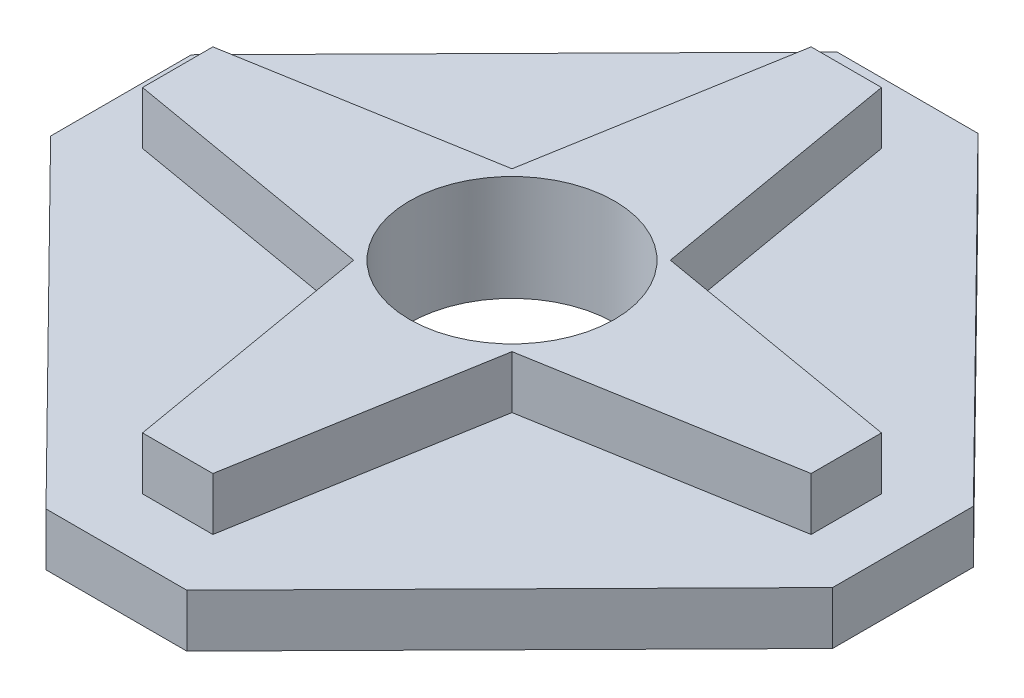
ISO-10303-21;
HEADER;
FILE_DESCRIPTION(('STEP AP214'),'2;1');
FILE_NAME('part.step','',(''),(''),'','','');
FILE_SCHEMA(('AUTOMOTIVE_DESIGN { 1 0 10303 214 1 1 1 1 }'));
ENDSEC;
DATA;
#1=APPLICATION_CONTEXT('core data for automotive mechanical design processes');
#2=APPLICATION_PROTOCOL_DEFINITION('international standard','automotive_design',2000,#1);
#3=PRODUCT_CONTEXT('',#1,'mechanical');
#4=PRODUCT('Part','Part','',(#3));
#5=PRODUCT_RELATED_PRODUCT_CATEGORY('part','',(#4));
#6=PRODUCT_DEFINITION_FORMATION('','',#4);
#7=PRODUCT_DEFINITION_CONTEXT('part definition',#1,'design');
#8=PRODUCT_DEFINITION('design','',#6,#7);
#9=PRODUCT_DEFINITION_SHAPE('','',#8);
#10=(LENGTH_UNIT() NAMED_UNIT(*) SI_UNIT(.MILLI.,.METRE.));
#11=(NAMED_UNIT(*) PLANE_ANGLE_UNIT() SI_UNIT($,.RADIAN.));
#12=(NAMED_UNIT(*) SI_UNIT($,.STERADIAN.) SOLID_ANGLE_UNIT());
#13=UNCERTAINTY_MEASURE_WITH_UNIT(LENGTH_MEASURE(1.E-05),#10,'distance_accuracy_value','');
#14=(GEOMETRIC_REPRESENTATION_CONTEXT(3) GLOBAL_UNCERTAINTY_ASSIGNED_CONTEXT((#13)) GLOBAL_UNIT_ASSIGNED_CONTEXT((#10,
#11,#12)) REPRESENTATION_CONTEXT('',''));
#15=CARTESIAN_POINT('',(0.,0.,0.));
#16=DIRECTION('',(0.,0.,1.));
#17=DIRECTION('',(1.,0.,0.));
#18=AXIS2_PLACEMENT_3D('',#15,#16,#17);
#19=CARTESIAN_POINT('',(2.,3.,-19.));
#20=DIRECTION('',(-0.985460115744348,0.,0.169906916507646));
#21=DIRECTION('',(0.169906916507646,0.,0.985460115744348));
#22=AXIS2_PLACEMENT_3D('',#19,#20,#21);
#23=PLANE('',#22);
#24=DIRECTION('',(-0.169906916507646,0.,-0.985460115744348));
#25=VECTOR('',#24,1.);
#26=CARTESIAN_POINT('',(2.,0.,-19.));
#27=LINE('',#26,#25);
#28=CARTESIAN_POINT('',(4.5,0.,-4.5));
#29=VERTEX_POINT('',#28);
#30=CARTESIAN_POINT('',(2.,0.,-19.));
#31=VERTEX_POINT('',#30);
#32=EDGE_CURVE('E257',#29,#31,#27,.T.);
#33=ORIENTED_EDGE('',*,*,#32,.T.);
#34=DIRECTION('',(0.,-1.,0.));
#35=VECTOR('',#34,1.);
#36=CARTESIAN_POINT('',(2.,3.,-19.));
#37=LINE('',#36,#35);
#38=CARTESIAN_POINT('',(2.,3.,-19.));
#39=VERTEX_POINT('',#38);
#40=EDGE_CURVE('E11',#39,#31,#37,.T.);
#41=ORIENTED_EDGE('',*,*,#40,.F.);
#42=DIRECTION('',(-0.169906916507646,0.,-0.985460115744348));
#43=VECTOR('',#42,1.);
#44=CARTESIAN_POINT('',(2.,3.,-19.));
#45=LINE('',#44,#43);
#46=CARTESIAN_POINT('',(4.5,3.,-4.5));
#47=VERTEX_POINT('',#46);
#48=EDGE_CURVE('E275',#47,#39,#45,.T.);
#49=ORIENTED_EDGE('',*,*,#48,.F.);
#50=DIRECTION('',(0.,-1.,0.));
#51=VECTOR('',#50,1.);
#52=CARTESIAN_POINT('',(4.5,3.,-4.5));
#53=LINE('',#52,#51);
#54=EDGE_CURVE('E311',#47,#29,#53,.T.);
#55=ORIENTED_EDGE('',*,*,#54,.T.);
#56=EDGE_LOOP('',(#33,#41,#49,#55));
#57=FACE_BOUND('',#56,.T.);
#58=ADVANCED_FACE('F39',(#57),#23,.F.);
#59=CARTESIAN_POINT('',(-2.,3.,-19.));
#60=DIRECTION('',(0.,0.,1.));
#61=DIRECTION('',(1.,0.,0.));
#62=AXIS2_PLACEMENT_3D('',#59,#60,#61);
#63=PLANE('',#62);
#64=DIRECTION('',(-1.,0.,0.));
#65=VECTOR('',#64,1.);
#66=CARTESIAN_POINT('',(-2.,0.,-19.));
#67=LINE('',#66,#65);
#68=CARTESIAN_POINT('',(-2.,0.,-19.));
#69=VERTEX_POINT('',#68);
#70=EDGE_CURVE('E315',#31,#69,#67,.T.);
#71=ORIENTED_EDGE('',*,*,#70,.T.);
#72=DIRECTION('',(0.,-1.,0.));
#73=VECTOR('',#72,1.);
#74=CARTESIAN_POINT('',(-2.,3.,-19.));
#75=LINE('',#74,#73);
#76=CARTESIAN_POINT('',(-2.,3.,-19.));
#77=VERTEX_POINT('',#76);
#78=EDGE_CURVE('E49',#77,#69,#75,.T.);
#79=ORIENTED_EDGE('',*,*,#78,.F.);
#80=DIRECTION('',(-1.,0.,0.));
#81=VECTOR('',#80,1.);
#82=CARTESIAN_POINT('',(-2.,3.,-19.));
#83=LINE('',#82,#81);
#84=EDGE_CURVE('E278',#39,#77,#83,.T.);
#85=ORIENTED_EDGE('',*,*,#84,.F.);
#86=ORIENTED_EDGE('',*,*,#40,.T.);
#87=EDGE_LOOP('',(#71,#79,#85,#86));
#88=FACE_BOUND('',#87,.T.);
#89=ADVANCED_FACE('F406',(#88),#63,.F.);
#90=CARTESIAN_POINT('',(-2.,3.,-19.));
#91=DIRECTION('',(0.985460115744348,0.,0.169906916507646));
#92=DIRECTION('',(0.169906916507646,0.,-0.985460115744348));
#93=AXIS2_PLACEMENT_3D('',#90,#91,#92);
#94=PLANE('',#93);
#95=DIRECTION('',(-0.169906916507646,0.,0.985460115744348));
#96=VECTOR('',#95,1.);
#97=CARTESIAN_POINT('',(-2.,0.,-19.));
#98=LINE('',#97,#96);
#99=CARTESIAN_POINT('',(-4.5,0.,-4.5));
#100=VERTEX_POINT('',#99);
#101=EDGE_CURVE('E319',#69,#100,#98,.T.);
#102=ORIENTED_EDGE('',*,*,#101,.T.);
#103=DIRECTION('',(0.,-1.,0.));
#104=VECTOR('',#103,1.);
#105=CARTESIAN_POINT('',(-4.5,3.,-4.5));
#106=LINE('',#105,#104);
#107=CARTESIAN_POINT('',(-4.5,3.,-4.5));
#108=VERTEX_POINT('',#107);
#109=EDGE_CURVE('E393',#108,#100,#106,.T.);
#110=ORIENTED_EDGE('',*,*,#109,.F.);
#111=DIRECTION('',(-0.169906916507646,0.,0.985460115744348));
#112=VECTOR('',#111,1.);
#113=CARTESIAN_POINT('',(-2.,3.,-19.));
#114=LINE('',#113,#112);
#115=EDGE_CURVE('E282',#77,#108,#114,.T.);
#116=ORIENTED_EDGE('',*,*,#115,.F.);
#117=ORIENTED_EDGE('',*,*,#78,.T.);
#118=EDGE_LOOP('',(#102,#110,#116,#117));
#119=FACE_BOUND('',#118,.T.);
#120=ADVANCED_FACE('F402',(#119),#94,.F.);
#121=CARTESIAN_POINT('',(-4.5,3.,-4.5));
#122=DIRECTION('',(0.169906916507646,0.,0.985460115744348));
#123=DIRECTION('',(0.985460115744348,0.,-0.169906916507646));
#124=AXIS2_PLACEMENT_3D('',#121,#122,#123);
#125=PLANE('',#124);
#126=DIRECTION('',(-0.985460115744348,0.,0.169906916507646));
#127=VECTOR('',#126,1.);
#128=CARTESIAN_POINT('',(-4.5,0.,-4.5));
#129=LINE('',#128,#127);
#130=CARTESIAN_POINT('',(-19.,0.,-2.));
#131=VERTEX_POINT('',#130);
#132=EDGE_CURVE('E323',#100,#131,#129,.T.);
#133=ORIENTED_EDGE('',*,*,#132,.T.);
#134=DIRECTION('',(0.,-1.,0.));
#135=VECTOR('',#134,1.);
#136=CARTESIAN_POINT('',(-19.,3.,-2.));
#137=LINE('',#136,#135);
#138=CARTESIAN_POINT('',(-19.,3.,-2.));
#139=VERTEX_POINT('',#138);
#140=EDGE_CURVE('E389',#139,#131,#137,.T.);
#141=ORIENTED_EDGE('',*,*,#140,.F.);
#142=DIRECTION('',(-0.985460115744348,0.,0.169906916507646));
#143=VECTOR('',#142,1.);
#144=CARTESIAN_POINT('',(-4.5,3.,-4.5));
#145=LINE('',#144,#143);
#146=EDGE_CURVE('E285',#108,#139,#145,.T.);
#147=ORIENTED_EDGE('',*,*,#146,.F.);
#148=ORIENTED_EDGE('',*,*,#109,.T.);
#149=EDGE_LOOP('',(#133,#141,#147,#148));
#150=FACE_BOUND('',#149,.T.);
#151=ADVANCED_FACE('F413',(#150),#125,.F.);
#152=CARTESIAN_POINT('',(-19.,3.,-2.));
#153=DIRECTION('',(1.,0.,0.));
#154=DIRECTION('',(0.,0.,-1.));
#155=AXIS2_PLACEMENT_3D('',#152,#153,#154);
#156=PLANE('',#155);
#157=DIRECTION('',(0.,0.,1.));
#158=VECTOR('',#157,1.);
#159=CARTESIAN_POINT('',(-19.,0.,-2.));
#160=LINE('',#159,#158);
#161=CARTESIAN_POINT('',(-19.,0.,2.));
#162=VERTEX_POINT('',#161);
#163=EDGE_CURVE('E327',#131,#162,#160,.T.);
#164=ORIENTED_EDGE('',*,*,#163,.T.);
#165=DIRECTION('',(0.,-1.,0.));
#166=VECTOR('',#165,1.);
#167=CARTESIAN_POINT('',(-19.,3.,2.));
#168=LINE('',#167,#166);
#169=CARTESIAN_POINT('',(-19.,3.,2.));
#170=VERTEX_POINT('',#169);
#171=EDGE_CURVE('E385',#170,#162,#168,.T.);
#172=ORIENTED_EDGE('',*,*,#171,.F.);
#173=DIRECTION('',(0.,0.,1.));
#174=VECTOR('',#173,1.);
#175=CARTESIAN_POINT('',(-19.,3.,-2.));
#176=LINE('',#175,#174);
#177=EDGE_CURVE('E288',#139,#170,#176,.T.);
#178=ORIENTED_EDGE('',*,*,#177,.F.);
#179=ORIENTED_EDGE('',*,*,#140,.T.);
#180=EDGE_LOOP('',(#164,#172,#178,#179));
#181=FACE_BOUND('',#180,.T.);
#182=ADVANCED_FACE('F417',(#181),#156,.F.);
#183=CARTESIAN_POINT('',(-4.5,3.,4.5));
#184=DIRECTION('',(0.169906916507646,0.,-0.985460115744348));
#185=DIRECTION('',(-0.985460115744348,0.,-0.169906916507646));
#186=AXIS2_PLACEMENT_3D('',#183,#184,#185);
#187=PLANE('',#186);
#188=DIRECTION('',(0.985460115744348,0.,0.169906916507646));
#189=VECTOR('',#188,1.);
#190=CARTESIAN_POINT('',(-4.5,0.,4.5));
#191=LINE('',#190,#189);
#192=CARTESIAN_POINT('',(-4.5,0.,4.5));
#193=VERTEX_POINT('',#192);
#194=EDGE_CURVE('E331',#162,#193,#191,.T.);
#195=ORIENTED_EDGE('',*,*,#194,.T.);
#196=DIRECTION('',(0.,-1.,0.));
#197=VECTOR('',#196,1.);
#198=CARTESIAN_POINT('',(-4.5,3.,4.5));
#199=LINE('',#198,#197);
#200=CARTESIAN_POINT('',(-4.5,3.,4.5));
#201=VERTEX_POINT('',#200);
#202=EDGE_CURVE('E381',#201,#193,#199,.T.);
#203=ORIENTED_EDGE('',*,*,#202,.F.);
#204=DIRECTION('',(0.985460115744348,0.,0.169906916507646));
#205=VECTOR('',#204,1.);
#206=CARTESIAN_POINT('',(-4.5,3.,4.5));
#207=LINE('',#206,#205);
#208=EDGE_CURVE('E291',#170,#201,#207,.T.);
#209=ORIENTED_EDGE('',*,*,#208,.F.);
#210=ORIENTED_EDGE('',*,*,#171,.T.);
#211=EDGE_LOOP('',(#195,#203,#209,#210));
#212=FACE_BOUND('',#211,.T.);
#213=ADVANCED_FACE('F447',(#212),#187,.F.);
#214=CARTESIAN_POINT('',(-1.99999999999999,3.,19.));
#215=DIRECTION('',(0.985460115744348,0.,-0.169906916507647));
#216=DIRECTION('',(-0.169906916507647,0.,-0.985460115744348));
#217=AXIS2_PLACEMENT_3D('',#214,#215,#216);
#218=PLANE('',#217);
#219=DIRECTION('',(0.169906916507647,0.,0.985460115744348));
#220=VECTOR('',#219,1.);
#221=CARTESIAN_POINT('',(-1.99999999999999,0.,19.));
#222=LINE('',#221,#220);
#223=CARTESIAN_POINT('',(-1.99999999999999,0.,19.));
#224=VERTEX_POINT('',#223);
#225=EDGE_CURVE('E335',#193,#224,#222,.T.);
#226=ORIENTED_EDGE('',*,*,#225,.T.);
#227=DIRECTION('',(0.,-1.,0.));
#228=VECTOR('',#227,1.);
#229=CARTESIAN_POINT('',(-1.99999999999999,3.,19.));
#230=LINE('',#229,#228);
#231=CARTESIAN_POINT('',(-1.99999999999999,3.,19.));
#232=VERTEX_POINT('',#231);
#233=EDGE_CURVE('E377',#232,#224,#230,.T.);
#234=ORIENTED_EDGE('',*,*,#233,.F.);
#235=DIRECTION('',(0.169906916507647,0.,0.985460115744348));
#236=VECTOR('',#235,1.);
#237=CARTESIAN_POINT('',(-1.99999999999999,3.,19.));
#238=LINE('',#237,#236);
#239=EDGE_CURVE('E294',#201,#232,#238,.T.);
#240=ORIENTED_EDGE('',*,*,#239,.F.);
#241=ORIENTED_EDGE('',*,*,#202,.T.);
#242=EDGE_LOOP('',(#226,#234,#240,#241));
#243=FACE_BOUND('',#242,.T.);
#244=ADVANCED_FACE('F444',(#243),#218,.F.);
#245=CARTESIAN_POINT('',(-1.99999999999999,3.,19.));
#246=DIRECTION('',(0.,0.,-1.));
#247=DIRECTION('',(-1.,0.,0.));
#248=AXIS2_PLACEMENT_3D('',#245,#246,#247);
#249=PLANE('',#248);
#250=DIRECTION('',(1.,0.,0.));
#251=VECTOR('',#250,1.);
#252=CARTESIAN_POINT('',(-1.99999999999999,0.,19.));
#253=LINE('',#252,#251);
#254=CARTESIAN_POINT('',(2.,0.,19.));
#255=VERTEX_POINT('',#254);
#256=EDGE_CURVE('E339',#224,#255,#253,.T.);
#257=ORIENTED_EDGE('',*,*,#256,.T.);
#258=DIRECTION('',(0.,-1.,0.));
#259=VECTOR('',#258,1.);
#260=CARTESIAN_POINT('',(2.,3.,19.));
#261=LINE('',#260,#259);
#262=CARTESIAN_POINT('',(2.,3.,19.));
#263=VERTEX_POINT('',#262);
#264=EDGE_CURVE('E373',#263,#255,#261,.T.);
#265=ORIENTED_EDGE('',*,*,#264,.F.);
#266=DIRECTION('',(1.,0.,0.));
#267=VECTOR('',#266,1.);
#268=CARTESIAN_POINT('',(-1.99999999999999,3.,19.));
#269=LINE('',#268,#267);
#270=EDGE_CURVE('E297',#232,#263,#269,.T.);
#271=ORIENTED_EDGE('',*,*,#270,.F.);
#272=ORIENTED_EDGE('',*,*,#233,.T.);
#273=EDGE_LOOP('',(#257,#265,#271,#272));
#274=FACE_BOUND('',#273,.T.);
#275=ADVANCED_FACE('F441',(#274),#249,.F.);
#276=CARTESIAN_POINT('',(2.,3.,19.));
#277=DIRECTION('',(-0.985460115744348,0.,-0.169906916507646));
#278=DIRECTION('',(-0.169906916507646,0.,0.985460115744348));
#279=AXIS2_PLACEMENT_3D('',#276,#277,#278);
#280=PLANE('',#279);
#281=DIRECTION('',(0.169906916507646,0.,-0.985460115744348));
#282=VECTOR('',#281,1.);
#283=CARTESIAN_POINT('',(2.,0.,19.));
#284=LINE('',#283,#282);
#285=CARTESIAN_POINT('',(4.5,0.,4.5));
#286=VERTEX_POINT('',#285);
#287=EDGE_CURVE('E343',#255,#286,#284,.T.);
#288=ORIENTED_EDGE('',*,*,#287,.T.);
#289=DIRECTION('',(0.,-1.,0.));
#290=VECTOR('',#289,1.);
#291=CARTESIAN_POINT('',(4.5,3.,4.5));
#292=LINE('',#291,#290);
#293=CARTESIAN_POINT('',(4.5,3.,4.5));
#294=VERTEX_POINT('',#293);
#295=EDGE_CURVE('E369',#294,#286,#292,.T.);
#296=ORIENTED_EDGE('',*,*,#295,.F.);
#297=DIRECTION('',(0.169906916507646,0.,-0.985460115744348));
#298=VECTOR('',#297,1.);
#299=CARTESIAN_POINT('',(2.,3.,19.));
#300=LINE('',#299,#298);
#301=EDGE_CURVE('E300',#263,#294,#300,.T.);
#302=ORIENTED_EDGE('',*,*,#301,.F.);
#303=ORIENTED_EDGE('',*,*,#264,.T.);
#304=EDGE_LOOP('',(#288,#296,#302,#303));
#305=FACE_BOUND('',#304,.T.);
#306=ADVANCED_FACE('F436',(#305),#280,.F.);
#307=CARTESIAN_POINT('',(4.5,3.,4.5));
#308=DIRECTION('',(-0.169906916507646,0.,-0.985460115744348));
#309=DIRECTION('',(-0.985460115744348,0.,0.169906916507646));
#310=AXIS2_PLACEMENT_3D('',#307,#308,#309);
#311=PLANE('',#310);
#312=DIRECTION('',(0.985460115744348,0.,-0.169906916507646));
#313=VECTOR('',#312,1.);
#314=CARTESIAN_POINT('',(4.5,0.,4.5));
#315=LINE('',#314,#313);
#316=CARTESIAN_POINT('',(19.,0.,2.));
#317=VERTEX_POINT('',#316);
#318=EDGE_CURVE('E347',#286,#317,#315,.T.);
#319=ORIENTED_EDGE('',*,*,#318,.T.);
#320=DIRECTION('',(0.,-1.,0.));
#321=VECTOR('',#320,1.);
#322=CARTESIAN_POINT('',(19.,3.,2.));
#323=LINE('',#322,#321);
#324=CARTESIAN_POINT('',(19.,3.,2.));
#325=VERTEX_POINT('',#324);
#326=EDGE_CURVE('E365',#325,#317,#323,.T.);
#327=ORIENTED_EDGE('',*,*,#326,.F.);
#328=DIRECTION('',(0.985460115744348,0.,-0.169906916507646));
#329=VECTOR('',#328,1.);
#330=CARTESIAN_POINT('',(4.5,3.,4.5));
#331=LINE('',#330,#329);
#332=EDGE_CURVE('E303',#294,#325,#331,.T.);
#333=ORIENTED_EDGE('',*,*,#332,.F.);
#334=ORIENTED_EDGE('',*,*,#295,.T.);
#335=EDGE_LOOP('',(#319,#327,#333,#334));
#336=FACE_BOUND('',#335,.T.);
#337=ADVANCED_FACE('F433',(#336),#311,.F.);
#338=CARTESIAN_POINT('',(19.,3.,-2.));
#339=DIRECTION('',(-1.,0.,0.));
#340=DIRECTION('',(0.,0.,1.));
#341=AXIS2_PLACEMENT_3D('',#338,#339,#340);
#342=PLANE('',#341);
#343=DIRECTION('',(0.,0.,-1.));
#344=VECTOR('',#343,1.);
#345=CARTESIAN_POINT('',(19.,0.,-2.));
#346=LINE('',#345,#344);
#347=CARTESIAN_POINT('',(19.,0.,-2.));
#348=VERTEX_POINT('',#347);
#349=EDGE_CURVE('E351',#317,#348,#346,.T.);
#350=ORIENTED_EDGE('',*,*,#349,.T.);
#351=DIRECTION('',(0.,-1.,0.));
#352=VECTOR('',#351,1.);
#353=CARTESIAN_POINT('',(19.,3.,-2.));
#354=LINE('',#353,#352);
#355=CARTESIAN_POINT('',(19.,3.,-2.));
#356=VERTEX_POINT('',#355);
#357=EDGE_CURVE('E361',#356,#348,#354,.T.);
#358=ORIENTED_EDGE('',*,*,#357,.F.);
#359=DIRECTION('',(0.,0.,-1.));
#360=VECTOR('',#359,1.);
#361=CARTESIAN_POINT('',(19.,3.,-2.));
#362=LINE('',#361,#360);
#363=EDGE_CURVE('E306',#325,#356,#362,.T.);
#364=ORIENTED_EDGE('',*,*,#363,.F.);
#365=ORIENTED_EDGE('',*,*,#326,.T.);
#366=EDGE_LOOP('',(#350,#358,#364,#365));
#367=FACE_BOUND('',#366,.T.);
#368=ADVANCED_FACE('F428',(#367),#342,.F.);
#369=CARTESIAN_POINT('',(4.5,3.,-4.5));
#370=DIRECTION('',(-0.169906916507646,0.,0.985460115744348));
#371=DIRECTION('',(0.985460115744348,0.,0.169906916507646));
#372=AXIS2_PLACEMENT_3D('',#369,#370,#371);
#373=PLANE('',#372);
#374=DIRECTION('',(-0.985460115744348,0.,-0.169906916507646));
#375=VECTOR('',#374,1.);
#376=CARTESIAN_POINT('',(4.5,0.,-4.5));
#377=LINE('',#376,#375);
#378=EDGE_CURVE('E279',#348,#29,#377,.T.);
#379=ORIENTED_EDGE('',*,*,#378,.T.);
#380=ORIENTED_EDGE('',*,*,#54,.F.);
#381=DIRECTION('',(-0.985460115744348,0.,-0.169906916507646));
#382=VECTOR('',#381,1.);
#383=CARTESIAN_POINT('',(4.5,3.,-4.5));
#384=LINE('',#383,#382);
#385=EDGE_CURVE('E56',#356,#47,#384,.T.);
#386=ORIENTED_EDGE('',*,*,#385,.F.);
#387=ORIENTED_EDGE('',*,*,#357,.T.);
#388=EDGE_LOOP('',(#379,#380,#386,#387));
#389=FACE_BOUND('',#388,.T.);
#390=ADVANCED_FACE('F425',(#389),#373,.F.);
#391=CARTESIAN_POINT('',(0.,3.,0.));
#392=DIRECTION('',(0.,1.,0.));
#393=DIRECTION('',(0.,0.,1.));
#394=AXIS2_PLACEMENT_3D('',#391,#392,#393);
#395=PLANE('',#394);
#396=CARTESIAN_POINT('',(0.,3.,0.));
#397=DIRECTION('',(0.,1.,0.));
#398=DIRECTION('',(0.,0.,1.));
#399=AXIS2_PLACEMENT_3D('',#396,#397,#398);
#400=CIRCLE('',#399,5.8291544910548);
#401=CARTESIAN_POINT('',(0.,3.,5.8291544910548));
#402=VERTEX_POINT('',#401);
#403=EDGE_CURVE('E209',#402,#402,#400,.F.);
#404=ORIENTED_EDGE('',*,*,#403,.T.);
#405=EDGE_LOOP('',(#404));
#406=FACE_BOUND('',#405,.T.);
#407=ORIENTED_EDGE('',*,*,#48,.T.);
#408=ORIENTED_EDGE('',*,*,#84,.T.);
#409=ORIENTED_EDGE('',*,*,#115,.T.);
#410=ORIENTED_EDGE('',*,*,#146,.T.);
#411=ORIENTED_EDGE('',*,*,#177,.T.);
#412=ORIENTED_EDGE('',*,*,#208,.T.);
#413=ORIENTED_EDGE('',*,*,#239,.T.);
#414=ORIENTED_EDGE('',*,*,#270,.T.);
#415=ORIENTED_EDGE('',*,*,#301,.T.);
#416=ORIENTED_EDGE('',*,*,#332,.T.);
#417=ORIENTED_EDGE('',*,*,#363,.T.);
#418=ORIENTED_EDGE('',*,*,#385,.T.);
#419=EDGE_LOOP('',(#407,#408,#409,#410,#411,#412,#413,#414,#415,#416,#417,#418));
#420=FACE_BOUND('',#419,.T.);
#421=ADVANCED_FACE('F420',(#406,#420),#395,.T.);
#422=CARTESIAN_POINT('',(-4.,-3.,-22.4839374692319));
#423=DIRECTION('',(-0.712134524828602,0.,-0.702043031834332));
#424=DIRECTION('',(-0.702043031834332,0.,0.712134524828602));
#425=AXIS2_PLACEMENT_3D('',#422,#423,#424);
#426=PLANE('',#425);
#427=DIRECTION('',(-0.702043031834332,0.,0.712134524828602));
#428=VECTOR('',#427,1.);
#429=CARTESIAN_POINT('',(-4.,0.,-22.4839374692319));
#430=LINE('',#429,#428);
#431=CARTESIAN_POINT('',(-4.,0.,-22.4839374692319));
#432=VERTEX_POINT('',#431);
#433=CARTESIAN_POINT('',(-22.2220058833111,0.,-4.));
#434=VERTEX_POINT('',#433);
#435=EDGE_CURVE('E231',#432,#434,#430,.T.);
#436=ORIENTED_EDGE('',*,*,#435,.F.);
#437=DIRECTION('',(0.,1.,0.));
#438=VECTOR('',#437,1.);
#439=CARTESIAN_POINT('',(-4.,-3.,-22.4839374692319));
#440=LINE('',#439,#438);
#441=CARTESIAN_POINT('',(-4.,-3.,-22.4839374692319));
#442=VERTEX_POINT('',#441);
#443=EDGE_CURVE('E200',#442,#432,#440,.T.);
#444=ORIENTED_EDGE('',*,*,#443,.F.);
#445=DIRECTION('',(-0.702043031834332,0.,0.712134524828602));
#446=VECTOR('',#445,1.);
#447=CARTESIAN_POINT('',(-4.,-3.,-22.4839374692319));
#448=LINE('',#447,#446);
#449=CARTESIAN_POINT('',(-22.2220058833111,-3.,-4.));
#450=VERTEX_POINT('',#449);
#451=EDGE_CURVE('E192',#442,#450,#448,.T.);
#452=ORIENTED_EDGE('',*,*,#451,.T.);
#453=DIRECTION('',(0.,1.,0.));
#454=VECTOR('',#453,1.);
#455=CARTESIAN_POINT('',(-22.2220058833111,-3.,-4.));
#456=LINE('',#455,#454);
#457=EDGE_CURVE('E173',#450,#434,#456,.T.);
#458=ORIENTED_EDGE('',*,*,#457,.T.);
#459=EDGE_LOOP('',(#436,#444,#452,#458));
#460=FACE_BOUND('',#459,.T.);
#461=ADVANCED_FACE('F199',(#460),#426,.T.);
#462=CARTESIAN_POINT('',(4.,-3.,-22.4839374692319));
#463=DIRECTION('',(0.,0.,-1.));
#464=DIRECTION('',(-1.,0.,0.));
#465=AXIS2_PLACEMENT_3D('',#462,#463,#464);
#466=PLANE('',#465);
#467=DIRECTION('',(-1.,0.,0.));
#468=VECTOR('',#467,1.);
#469=CARTESIAN_POINT('',(4.,0.,-22.4839374692319));
#470=LINE('',#469,#468);
#471=CARTESIAN_POINT('',(4.,0.,-22.4839374692319));
#472=VERTEX_POINT('',#471);
#473=EDGE_CURVE('E202',#472,#432,#470,.T.);
#474=ORIENTED_EDGE('',*,*,#473,.F.);
#475=DIRECTION('',(0.,1.,0.));
#476=VECTOR('',#475,1.);
#477=CARTESIAN_POINT('',(4.,-3.,-22.4839374692319));
#478=LINE('',#477,#476);
#479=CARTESIAN_POINT('',(4.,-3.,-22.4839374692319));
#480=VERTEX_POINT('',#479);
#481=EDGE_CURVE('E258',#480,#472,#478,.T.);
#482=ORIENTED_EDGE('',*,*,#481,.F.);
#483=DIRECTION('',(-1.,0.,0.));
#484=VECTOR('',#483,1.);
#485=CARTESIAN_POINT('',(4.,-3.,-22.4839374692319));
#486=LINE('',#485,#484);
#487=EDGE_CURVE('E185',#480,#442,#486,.T.);
#488=ORIENTED_EDGE('',*,*,#487,.T.);
#489=ORIENTED_EDGE('',*,*,#443,.T.);
#490=EDGE_LOOP('',(#474,#482,#488,#489));
#491=FACE_BOUND('',#490,.T.);
#492=ADVANCED_FACE('F535',(#491),#466,.T.);
#493=CARTESIAN_POINT('',(4.,-3.,-22.4839374692319));
#494=DIRECTION('',(0.712134524828602,0.,-0.702043031834332));
#495=DIRECTION('',(-0.702043031834332,0.,-0.712134524828602));
#496=AXIS2_PLACEMENT_3D('',#493,#494,#495);
#497=PLANE('',#496);
#498=DIRECTION('',(-0.702043031834332,0.,-0.712134524828602));
#499=VECTOR('',#498,1.);
#500=CARTESIAN_POINT('',(4.,0.,-22.4839374692319));
#501=LINE('',#500,#499);
#502=CARTESIAN_POINT('',(22.2220058833111,0.,-4.00000000000001));
#503=VERTEX_POINT('',#502);
#504=EDGE_CURVE('E206',#503,#472,#501,.T.);
#505=ORIENTED_EDGE('',*,*,#504,.F.);
#506=DIRECTION('',(0.,1.,0.));
#507=VECTOR('',#506,1.);
#508=CARTESIAN_POINT('',(22.2220058833111,-3.,-4.00000000000001));
#509=LINE('',#508,#507);
#510=CARTESIAN_POINT('',(22.2220058833111,-3.,-4.00000000000001));
#511=VERTEX_POINT('',#510);
#512=EDGE_CURVE('E261',#511,#503,#509,.T.);
#513=ORIENTED_EDGE('',*,*,#512,.F.);
#514=DIRECTION('',(-0.702043031834332,0.,-0.712134524828602));
#515=VECTOR('',#514,1.);
#516=CARTESIAN_POINT('',(4.,-3.,-22.4839374692319));
#517=LINE('',#516,#515);
#518=EDGE_CURVE('E225',#511,#480,#517,.T.);
#519=ORIENTED_EDGE('',*,*,#518,.T.);
#520=ORIENTED_EDGE('',*,*,#481,.T.);
#521=EDGE_LOOP('',(#505,#513,#519,#520));
#522=FACE_BOUND('',#521,.T.);
#523=ADVANCED_FACE('F544',(#522),#497,.T.);
#524=CARTESIAN_POINT('',(22.2220058833111,-3.,-4.00000000000001));
#525=DIRECTION('',(1.,0.,0.));
#526=DIRECTION('',(0.,0.,-1.));
#527=AXIS2_PLACEMENT_3D('',#524,#525,#526);
#528=PLANE('',#527);
#529=DIRECTION('',(0.,0.,-1.));
#530=VECTOR('',#529,1.);
#531=CARTESIAN_POINT('',(22.2220058833111,0.,-4.00000000000001));
#532=LINE('',#531,#530);
#533=CARTESIAN_POINT('',(22.2220058833111,0.,4.00000000000001));
#534=VERTEX_POINT('',#533);
#535=EDGE_CURVE('E248',#534,#503,#532,.T.);
#536=ORIENTED_EDGE('',*,*,#535,.F.);
#537=DIRECTION('',(0.,1.,0.));
#538=VECTOR('',#537,1.);
#539=CARTESIAN_POINT('',(22.2220058833111,-3.,4.00000000000001));
#540=LINE('',#539,#538);
#541=CARTESIAN_POINT('',(22.2220058833111,-3.,4.00000000000001));
#542=VERTEX_POINT('',#541);
#543=EDGE_CURVE('E264',#542,#534,#540,.T.);
#544=ORIENTED_EDGE('',*,*,#543,.F.);
#545=DIRECTION('',(0.,0.,-1.));
#546=VECTOR('',#545,1.);
#547=CARTESIAN_POINT('',(22.2220058833111,-3.,-4.00000000000001));
#548=LINE('',#547,#546);
#549=EDGE_CURVE('E221',#542,#511,#548,.T.);
#550=ORIENTED_EDGE('',*,*,#549,.T.);
#551=ORIENTED_EDGE('',*,*,#512,.T.);
#552=EDGE_LOOP('',(#536,#544,#550,#551));
#553=FACE_BOUND('',#552,.T.);
#554=ADVANCED_FACE('F554',(#553),#528,.T.);
#555=CARTESIAN_POINT('',(4.,-3.,22.4839374692319));
#556=DIRECTION('',(0.712134524828602,0.,0.702043031834332));
#557=DIRECTION('',(0.702043031834332,0.,-0.712134524828602));
#558=AXIS2_PLACEMENT_3D('',#555,#556,#557);
#559=PLANE('',#558);
#560=DIRECTION('',(0.702043031834332,0.,-0.712134524828602));
#561=VECTOR('',#560,1.);
#562=CARTESIAN_POINT('',(4.,0.,22.4839374692319));
#563=LINE('',#562,#561);
#564=CARTESIAN_POINT('',(4.,0.,22.4839374692319));
#565=VERTEX_POINT('',#564);
#566=EDGE_CURVE('E244',#565,#534,#563,.T.);
#567=ORIENTED_EDGE('',*,*,#566,.F.);
#568=DIRECTION('',(0.,1.,0.));
#569=VECTOR('',#568,1.);
#570=CARTESIAN_POINT('',(4.,-3.,22.4839374692319));
#571=LINE('',#570,#569);
#572=CARTESIAN_POINT('',(4.,-3.,22.4839374692319));
#573=VERTEX_POINT('',#572);
#574=EDGE_CURVE('E267',#573,#565,#571,.T.);
#575=ORIENTED_EDGE('',*,*,#574,.F.);
#576=DIRECTION('',(0.702043031834332,0.,-0.712134524828602));
#577=VECTOR('',#576,1.);
#578=CARTESIAN_POINT('',(4.,-3.,22.4839374692319));
#579=LINE('',#578,#577);
#580=EDGE_CURVE('E217',#573,#542,#579,.T.);
#581=ORIENTED_EDGE('',*,*,#580,.T.);
#582=ORIENTED_EDGE('',*,*,#543,.T.);
#583=EDGE_LOOP('',(#567,#575,#581,#582));
#584=FACE_BOUND('',#583,.T.);
#585=ADVANCED_FACE('F564',(#584),#559,.T.);
#586=CARTESIAN_POINT('',(4.,-3.,22.4839374692319));
#587=DIRECTION('',(0.,0.,1.));
#588=DIRECTION('',(1.,0.,0.));
#589=AXIS2_PLACEMENT_3D('',#586,#587,#588);
#590=PLANE('',#589);
#591=DIRECTION('',(1.,0.,0.));
#592=VECTOR('',#591,1.);
#593=CARTESIAN_POINT('',(4.,0.,22.4839374692319));
#594=LINE('',#593,#592);
#595=CARTESIAN_POINT('',(-4.,0.,22.4839374692319));
#596=VERTEX_POINT('',#595);
#597=EDGE_CURVE('E240',#596,#565,#594,.T.);
#598=ORIENTED_EDGE('',*,*,#597,.F.);
#599=DIRECTION('',(0.,1.,0.));
#600=VECTOR('',#599,1.);
#601=CARTESIAN_POINT('',(-4.,-3.,22.4839374692319));
#602=LINE('',#601,#600);
#603=CARTESIAN_POINT('',(-4.,-3.,22.4839374692319));
#604=VERTEX_POINT('',#603);
#605=EDGE_CURVE('E270',#604,#596,#602,.T.);
#606=ORIENTED_EDGE('',*,*,#605,.F.);
#607=DIRECTION('',(1.,0.,0.));
#608=VECTOR('',#607,1.);
#609=CARTESIAN_POINT('',(4.,-3.,22.4839374692319));
#610=LINE('',#609,#608);
#611=EDGE_CURVE('E213',#604,#573,#610,.T.);
#612=ORIENTED_EDGE('',*,*,#611,.T.);
#613=ORIENTED_EDGE('',*,*,#574,.T.);
#614=EDGE_LOOP('',(#598,#606,#612,#613));
#615=FACE_BOUND('',#614,.T.);
#616=ADVANCED_FACE('F574',(#615),#590,.T.);
#617=CARTESIAN_POINT('',(-4.,-3.,22.4839374692319));
#618=DIRECTION('',(-0.712134524828602,0.,0.702043031834332));
#619=DIRECTION('',(0.702043031834332,0.,0.712134524828602));
#620=AXIS2_PLACEMENT_3D('',#617,#618,#619);
#621=PLANE('',#620);
#622=DIRECTION('',(0.702043031834332,0.,0.712134524828602));
#623=VECTOR('',#622,1.);
#624=CARTESIAN_POINT('',(-4.,0.,22.4839374692319));
#625=LINE('',#624,#623);
#626=CARTESIAN_POINT('',(-22.2220058833111,0.,4.));
#627=VERTEX_POINT('',#626);
#628=EDGE_CURVE('E236',#627,#596,#625,.T.);
#629=ORIENTED_EDGE('',*,*,#628,.F.);
#630=DIRECTION('',(0.,1.,0.));
#631=VECTOR('',#630,1.);
#632=CARTESIAN_POINT('',(-22.2220058833111,-3.,4.));
#633=LINE('',#632,#631);
#634=CARTESIAN_POINT('',(-22.2220058833111,-3.,4.));
#635=VERTEX_POINT('',#634);
#636=EDGE_CURVE('E184',#635,#627,#633,.T.);
#637=ORIENTED_EDGE('',*,*,#636,.F.);
#638=DIRECTION('',(0.702043031834332,0.,0.712134524828602));
#639=VECTOR('',#638,1.);
#640=CARTESIAN_POINT('',(-4.,-3.,22.4839374692319));
#641=LINE('',#640,#639);
#642=EDGE_CURVE('E196',#635,#604,#641,.T.);
#643=ORIENTED_EDGE('',*,*,#642,.T.);
#644=ORIENTED_EDGE('',*,*,#605,.T.);
#645=EDGE_LOOP('',(#629,#637,#643,#644));
#646=FACE_BOUND('',#645,.T.);
#647=ADVANCED_FACE('F584',(#646),#621,.T.);
#648=CARTESIAN_POINT('',(-22.2220058833111,-3.,-4.));
#649=DIRECTION('',(-1.,0.,0.));
#650=DIRECTION('',(0.,0.,1.));
#651=AXIS2_PLACEMENT_3D('',#648,#649,#650);
#652=PLANE('',#651);
#653=DIRECTION('',(0.,0.,1.));
#654=VECTOR('',#653,1.);
#655=CARTESIAN_POINT('',(-22.2220058833111,0.,-4.));
#656=LINE('',#655,#654);
#657=EDGE_CURVE('E178',#434,#627,#656,.T.);
#658=ORIENTED_EDGE('',*,*,#657,.F.);
#659=ORIENTED_EDGE('',*,*,#457,.F.);
#660=DIRECTION('',(0.,0.,1.));
#661=VECTOR('',#660,1.);
#662=CARTESIAN_POINT('',(-22.2220058833111,-3.,-4.));
#663=LINE('',#662,#661);
#664=EDGE_CURVE('E176',#450,#635,#663,.T.);
#665=ORIENTED_EDGE('',*,*,#664,.T.);
#666=ORIENTED_EDGE('',*,*,#636,.T.);
#667=EDGE_LOOP('',(#658,#659,#665,#666));
#668=FACE_BOUND('',#667,.T.);
#669=ADVANCED_FACE('F175',(#668),#652,.T.);
#670=CARTESIAN_POINT('',(0.,-3.,0.));
#671=DIRECTION('',(0.,-1.,0.));
#672=DIRECTION('',(0.,0.,-1.));
#673=AXIS2_PLACEMENT_3D('',#670,#671,#672);
#674=PLANE('',#673);
#675=CARTESIAN_POINT('',(0.,-3.,0.));
#676=DIRECTION('',(0.,-1.,0.));
#677=DIRECTION('',(0.,0.,-1.));
#678=AXIS2_PLACEMENT_3D('',#675,#676,#677);
#679=CIRCLE('',#678,5.8291544910548);
#680=CARTESIAN_POINT('',(0.,-3.,-5.8291544910548));
#681=VERTEX_POINT('',#680);
#682=EDGE_CURVE('E42',#681,#681,#679,.F.);
#683=ORIENTED_EDGE('',*,*,#682,.T.);
#684=EDGE_LOOP('',(#683));
#685=FACE_BOUND('',#684,.T.);
#686=ORIENTED_EDGE('',*,*,#451,.F.);
#687=ORIENTED_EDGE('',*,*,#487,.F.);
#688=ORIENTED_EDGE('',*,*,#518,.F.);
#689=ORIENTED_EDGE('',*,*,#549,.F.);
#690=ORIENTED_EDGE('',*,*,#580,.F.);
#691=ORIENTED_EDGE('',*,*,#611,.F.);
#692=ORIENTED_EDGE('',*,*,#642,.F.);
#693=ORIENTED_EDGE('',*,*,#664,.F.);
#694=EDGE_LOOP('',(#686,#687,#688,#689,#690,#691,#692,#693));
#695=FACE_BOUND('',#694,.T.);
#696=ADVANCED_FACE('F190',(#685,#695),#674,.T.);
#697=CARTESIAN_POINT('',(0.,0.,0.));
#698=DIRECTION('',(0.,-1.,0.));
#699=DIRECTION('',(0.,0.,-1.));
#700=AXIS2_PLACEMENT_3D('',#697,#698,#699);
#701=PLANE('',#700);
#702=ORIENTED_EDGE('',*,*,#32,.F.);
#703=ORIENTED_EDGE('',*,*,#378,.F.);
#704=ORIENTED_EDGE('',*,*,#349,.F.);
#705=ORIENTED_EDGE('',*,*,#318,.F.);
#706=ORIENTED_EDGE('',*,*,#287,.F.);
#707=ORIENTED_EDGE('',*,*,#256,.F.);
#708=ORIENTED_EDGE('',*,*,#225,.F.);
#709=ORIENTED_EDGE('',*,*,#194,.F.);
#710=ORIENTED_EDGE('',*,*,#163,.F.);
#711=ORIENTED_EDGE('',*,*,#132,.F.);
#712=ORIENTED_EDGE('',*,*,#101,.F.);
#713=ORIENTED_EDGE('',*,*,#70,.F.);
#714=EDGE_LOOP('',(#702,#703,#704,#705,#706,#707,#708,#709,#710,#711,#712,#713));
#715=FACE_BOUND('',#714,.T.);
#716=ORIENTED_EDGE('',*,*,#435,.T.);
#717=ORIENTED_EDGE('',*,*,#657,.T.);
#718=ORIENTED_EDGE('',*,*,#628,.T.);
#719=ORIENTED_EDGE('',*,*,#597,.T.);
#720=ORIENTED_EDGE('',*,*,#566,.T.);
#721=ORIENTED_EDGE('',*,*,#535,.T.);
#722=ORIENTED_EDGE('',*,*,#504,.T.);
#723=ORIENTED_EDGE('',*,*,#473,.T.);
#724=EDGE_LOOP('',(#716,#717,#718,#719,#720,#721,#722,#723));
#725=FACE_BOUND('',#724,.T.);
#726=ADVANCED_FACE('F409',(#715,#725),#701,.F.);
#727=CARTESIAN_POINT('',(0.,10.,0.));
#728=DIRECTION('',(0.,-1.,0.));
#729=DIRECTION('',(0.,0.,-1.));
#730=AXIS2_PLACEMENT_3D('',#727,#728,#729);
#731=CYLINDRICAL_SURFACE('',#730,5.8291544910548);
#732=ORIENTED_EDGE('',*,*,#403,.F.);
#733=EDGE_LOOP('',(#732));
#734=FACE_BOUND('',#733,.T.);
#735=ORIENTED_EDGE('',*,*,#682,.F.);
#736=EDGE_LOOP('',(#735));
#737=FACE_BOUND('',#736,.T.);
#738=ADVANCED_FACE('F613',(#734,#737),#731,.F.);
#739=CLOSED_SHELL('',(#58,#89,#120,#151,#182,#213,#244,#275,#306,#337,#368,#390,#421,#461,#492,
#523,#554,#585,#616,#647,#669,#696,#726,#738));
#740=MANIFOLD_SOLID_BREP('B2',#739);
#741=ADVANCED_BREP_SHAPE_REPRESENTATION('',(#18,#740),#14);
#742=SHAPE_DEFINITION_REPRESENTATION(#9,#741);
ENDSEC;
END-ISO-10303-21;
